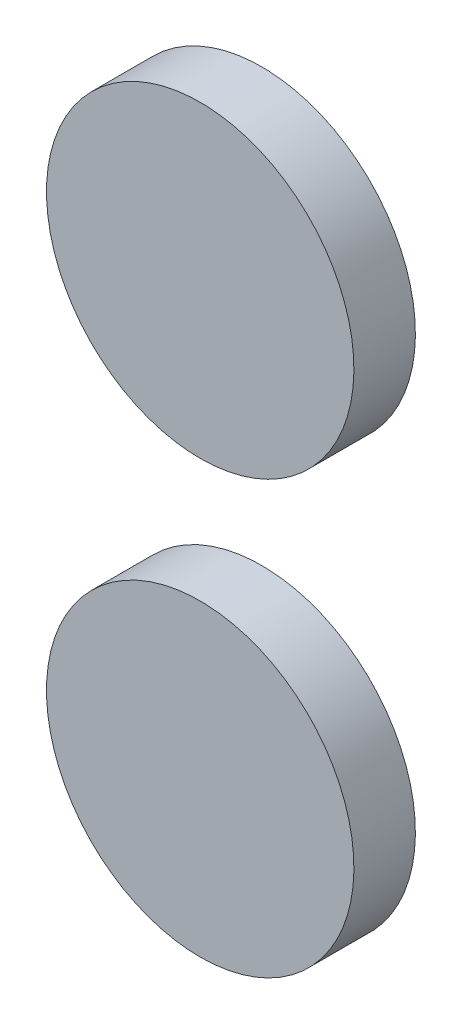
ISO-10303-21;
HEADER;
FILE_DESCRIPTION(('STEP AP214'),'2;1');
FILE_NAME('part.step','',(''),(''),'','','');
FILE_SCHEMA(('AUTOMOTIVE_DESIGN { 1 0 10303 214 1 1 1 1 }'));
ENDSEC;
DATA;
#1=APPLICATION_CONTEXT('core data for automotive mechanical design processes');
#2=APPLICATION_PROTOCOL_DEFINITION('international standard','automotive_design',2000,#1);
#3=PRODUCT_CONTEXT('',#1,'mechanical');
#4=PRODUCT('Part','Part','',(#3));
#5=PRODUCT_RELATED_PRODUCT_CATEGORY('part','',(#4));
#6=PRODUCT_DEFINITION_FORMATION('','',#4);
#7=PRODUCT_DEFINITION_CONTEXT('part definition',#1,'design');
#8=PRODUCT_DEFINITION('design','',#6,#7);
#9=PRODUCT_DEFINITION_SHAPE('','',#8);
#10=(LENGTH_UNIT() NAMED_UNIT(*) SI_UNIT(.MILLI.,.METRE.));
#11=(NAMED_UNIT(*) PLANE_ANGLE_UNIT() SI_UNIT($,.RADIAN.));
#12=(NAMED_UNIT(*) SI_UNIT($,.STERADIAN.) SOLID_ANGLE_UNIT());
#13=UNCERTAINTY_MEASURE_WITH_UNIT(LENGTH_MEASURE(1.E-05),#10,'distance_accuracy_value','');
#14=(GEOMETRIC_REPRESENTATION_CONTEXT(3) GLOBAL_UNCERTAINTY_ASSIGNED_CONTEXT((#13)) GLOBAL_UNIT_ASSIGNED_CONTEXT((#10,
#11,#12)) REPRESENTATION_CONTEXT('',''));
#15=CARTESIAN_POINT('',(0.,0.,0.));
#16=DIRECTION('',(0.,0.,1.));
#17=DIRECTION('',(1.,0.,0.));
#18=AXIS2_PLACEMENT_3D('',#15,#16,#17);
#19=CARTESIAN_POINT('',(5.40000000000001,57.754468913856,0.5));
#20=DIRECTION('',(0.,0.,1.));
#21=DIRECTION('',(0.,-1.,0.));
#22=AXIS2_PLACEMENT_3D('',#19,#20,#21);
#23=ELLIPSE('',#22,1.2543327686242,1.25);
#24=DIRECTION('',(0.,0.,-1.));
#25=VECTOR('',#24,1.);
#26=SURFACE_OF_LINEAR_EXTRUSION('',#23,#25);
#27=CARTESIAN_POINT('',(5.40000000000001,56.5001361452318,0.5));
#28=VERTEX_POINT('',#27);
#29=EDGE_CURVE('E11',#28,#28,#23,.T.);
#30=ORIENTED_EDGE('',*,*,#29,.F.);
#31=EDGE_LOOP('',(#30));
#32=FACE_BOUND('',#31,.T.);
#33=CARTESIAN_POINT('',(5.40000000000001,57.754468913856,0.));
#34=DIRECTION('',(0.,0.,1.));
#35=DIRECTION('',(0.,-1.,0.));
#36=AXIS2_PLACEMENT_3D('',#33,#34,#35);
#37=ELLIPSE('',#36,1.2543327686242,1.25);
#38=CARTESIAN_POINT('',(5.40000000000001,56.5001361452318,0.));
#39=VERTEX_POINT('',#38);
#40=EDGE_CURVE('E44',#39,#39,#37,.T.);
#41=ORIENTED_EDGE('',*,*,#40,.T.);
#42=EDGE_LOOP('',(#41));
#43=FACE_BOUND('',#42,.T.);
#44=ADVANCED_FACE('F40',(#32,#43),#26,.F.);
#45=CARTESIAN_POINT('',(5.40000000000001,57.754468913856,0.5));
#46=DIRECTION('',(0.,0.,1.));
#47=DIRECTION('',(1.,0.,0.));
#48=AXIS2_PLACEMENT_3D('',#45,#46,#47);
#49=PLANE('',#48);
#50=ORIENTED_EDGE('',*,*,#29,.T.);
#51=EDGE_LOOP('',(#50));
#52=FACE_BOUND('',#51,.T.);
#53=ADVANCED_FACE('F56',(#52),#49,.T.);
#54=CARTESIAN_POINT('',(5.40000000000001,57.754468913856,0.));
#55=DIRECTION('',(0.,0.,1.));
#56=DIRECTION('',(1.,0.,0.));
#57=AXIS2_PLACEMENT_3D('',#54,#55,#56);
#58=PLANE('',#57);
#59=ORIENTED_EDGE('',*,*,#40,.F.);
#60=EDGE_LOOP('',(#59));
#61=FACE_BOUND('',#60,.T.);
#62=ADVANCED_FACE('F54',(#61),#58,.F.);
#63=CLOSED_SHELL('',(#44,#53,#62));
#64=MANIFOLD_SOLID_BREP('B2',#63);
#65=CARTESIAN_POINT('',(5.40000000000001,61.2666006660038,0.5));
#66=DIRECTION('',(0.,0.,1.));
#67=DIRECTION('',(0.,-1.,0.));
#68=AXIS2_PLACEMENT_3D('',#65,#66,#67);
#69=ELLIPSE('',#68,1.2543327686242,1.25);
#70=DIRECTION('',(0.,0.,-1.));
#71=VECTOR('',#70,1.);
#72=SURFACE_OF_LINEAR_EXTRUSION('',#69,#71);
#73=CARTESIAN_POINT('',(5.40000000000001,60.0122678973796,0.5));
#74=VERTEX_POINT('',#73);
#75=EDGE_CURVE('E39',#74,#74,#69,.T.);
#76=ORIENTED_EDGE('',*,*,#75,.F.);
#77=EDGE_LOOP('',(#76));
#78=FACE_BOUND('',#77,.T.);
#79=CARTESIAN_POINT('',(5.40000000000001,61.2666006660038,0.));
#80=DIRECTION('',(0.,0.,1.));
#81=DIRECTION('',(0.,-1.,0.));
#82=AXIS2_PLACEMENT_3D('',#79,#80,#81);
#83=ELLIPSE('',#82,1.2543327686242,1.25);
#84=CARTESIAN_POINT('',(5.40000000000001,60.0122678973796,0.));
#85=VERTEX_POINT('',#84);
#86=EDGE_CURVE('E87',#85,#85,#83,.T.);
#87=ORIENTED_EDGE('',*,*,#86,.T.);
#88=EDGE_LOOP('',(#87));
#89=FACE_BOUND('',#88,.T.);
#90=ADVANCED_FACE('F83',(#78,#89),#72,.F.);
#91=CARTESIAN_POINT('',(5.40000000000001,61.2666006660038,0.5));
#92=DIRECTION('',(0.,0.,1.));
#93=DIRECTION('',(1.,0.,0.));
#94=AXIS2_PLACEMENT_3D('',#91,#92,#93);
#95=PLANE('',#94);
#96=ORIENTED_EDGE('',*,*,#75,.T.);
#97=EDGE_LOOP('',(#96));
#98=FACE_BOUND('',#97,.T.);
#99=ADVANCED_FACE('F99',(#98),#95,.T.);
#100=CARTESIAN_POINT('',(5.40000000000001,61.2666006660038,0.));
#101=DIRECTION('',(0.,0.,1.));
#102=DIRECTION('',(1.,0.,0.));
#103=AXIS2_PLACEMENT_3D('',#100,#101,#102);
#104=PLANE('',#103);
#105=ORIENTED_EDGE('',*,*,#86,.F.);
#106=EDGE_LOOP('',(#105));
#107=FACE_BOUND('',#106,.T.);
#108=ADVANCED_FACE('F97',(#107),#104,.F.);
#109=CLOSED_SHELL('',(#90,#99,#108));
#110=MANIFOLD_SOLID_BREP('B6',#109);
#111=ADVANCED_BREP_SHAPE_REPRESENTATION('',(#18,#64,#110),#14);
#112=SHAPE_DEFINITION_REPRESENTATION(#9,#111);
ENDSEC;
END-ISO-10303-21;
